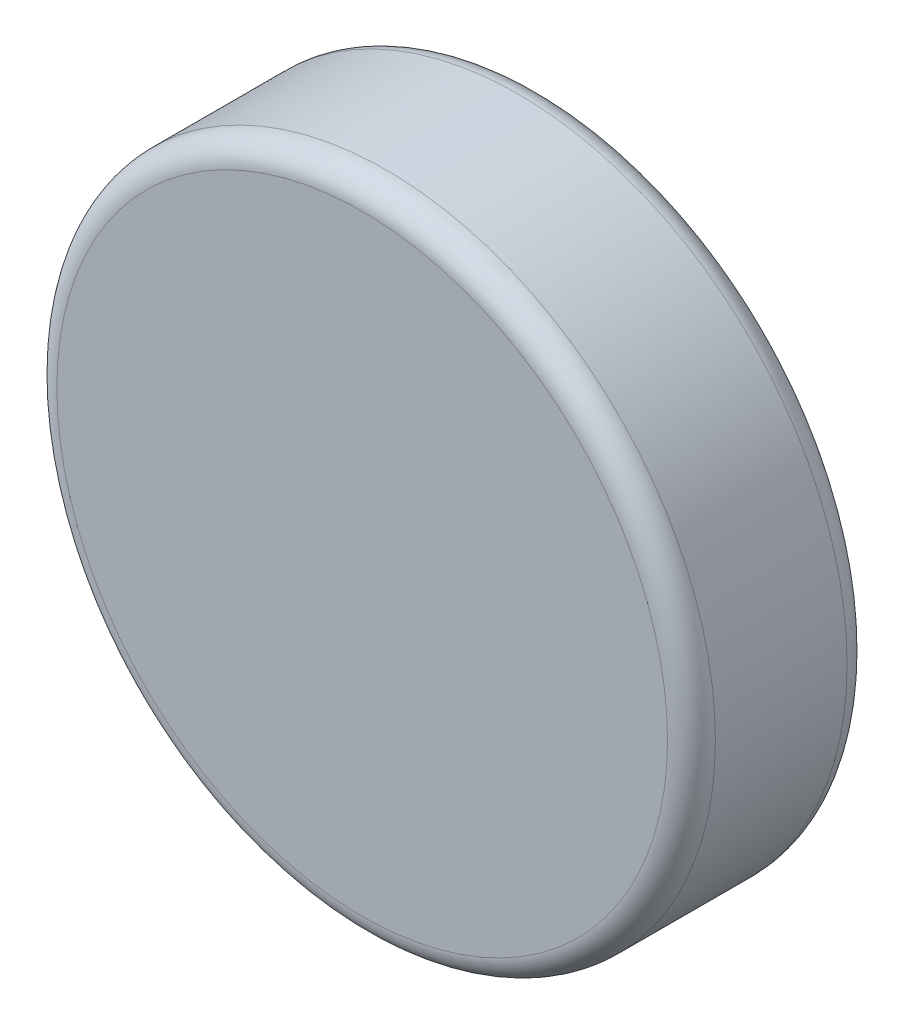
ISO-10303-21;
HEADER;
FILE_DESCRIPTION(('STEP AP214'),'2;1');
FILE_NAME('part.step','',(''),(''),'','','');
FILE_SCHEMA(('AUTOMOTIVE_DESIGN { 1 0 10303 214 1 1 1 1 }'));
ENDSEC;
DATA;
#1=APPLICATION_CONTEXT('core data for automotive mechanical design processes');
#2=APPLICATION_PROTOCOL_DEFINITION('international standard','automotive_design',2000,#1);
#3=PRODUCT_CONTEXT('',#1,'mechanical');
#4=PRODUCT('Part','Part','',(#3));
#5=PRODUCT_RELATED_PRODUCT_CATEGORY('part','',(#4));
#6=PRODUCT_DEFINITION_FORMATION('','',#4);
#7=PRODUCT_DEFINITION_CONTEXT('part definition',#1,'design');
#8=PRODUCT_DEFINITION('design','',#6,#7);
#9=PRODUCT_DEFINITION_SHAPE('','',#8);
#10=(LENGTH_UNIT() NAMED_UNIT(*) SI_UNIT(.MILLI.,.METRE.));
#11=(NAMED_UNIT(*) PLANE_ANGLE_UNIT() SI_UNIT($,.RADIAN.));
#12=(NAMED_UNIT(*) SI_UNIT($,.STERADIAN.) SOLID_ANGLE_UNIT());
#13=UNCERTAINTY_MEASURE_WITH_UNIT(LENGTH_MEASURE(1.E-05),#10,'distance_accuracy_value','');
#14=(GEOMETRIC_REPRESENTATION_CONTEXT(3) GLOBAL_UNCERTAINTY_ASSIGNED_CONTEXT((#13)) GLOBAL_UNIT_ASSIGNED_CONTEXT((#10,
#11,#12)) REPRESENTATION_CONTEXT('',''));
#15=CARTESIAN_POINT('',(0.,0.,0.));
#16=DIRECTION('',(0.,0.,1.));
#17=DIRECTION('',(1.,0.,0.));
#18=AXIS2_PLACEMENT_3D('',#15,#16,#17);
#19=CARTESIAN_POINT('',(0.,0.,15.));
#20=DIRECTION('',(0.,0.,-1.));
#21=DIRECTION('',(-1.,0.,0.));
#22=AXIS2_PLACEMENT_3D('',#19,#20,#21);
#23=CYLINDRICAL_SURFACE('',#22,27.5);
#24=CARTESIAN_POINT('',(0.,0.,2.));
#25=DIRECTION('',(0.,0.,1.));
#26=DIRECTION('',(1.,0.,0.));
#27=AXIS2_PLACEMENT_3D('',#24,#25,#26);
#28=CIRCLE('',#27,27.5);
#29=CARTESIAN_POINT('',(27.5,0.,2.));
#30=VERTEX_POINT('',#29);
#31=EDGE_CURVE('E45',#30,#30,#28,.T.);
#32=ORIENTED_EDGE('',*,*,#31,.T.);
#33=EDGE_LOOP('',(#32));
#34=FACE_BOUND('',#33,.T.);
#35=CARTESIAN_POINT('',(0.,0.,13.));
#36=DIRECTION('',(0.,0.,1.));
#37=DIRECTION('',(1.,0.,0.));
#38=AXIS2_PLACEMENT_3D('',#35,#36,#37);
#39=CIRCLE('',#38,27.5);
#40=CARTESIAN_POINT('',(27.5,0.,13.));
#41=VERTEX_POINT('',#40);
#42=EDGE_CURVE('E49',#41,#41,#39,.F.);
#43=ORIENTED_EDGE('',*,*,#42,.T.);
#44=EDGE_LOOP('',(#43));
#45=FACE_BOUND('',#44,.T.);
#46=ADVANCED_FACE('F34',(#34,#45),#23,.T.);
#47=CARTESIAN_POINT('',(0.,0.,15.));
#48=DIRECTION('',(0.,0.,1.));
#49=DIRECTION('',(1.,0.,0.));
#50=AXIS2_PLACEMENT_3D('',#47,#48,#49);
#51=PLANE('',#50);
#52=CARTESIAN_POINT('',(0.,0.,15.));
#53=DIRECTION('',(0.,0.,1.));
#54=DIRECTION('',(1.,0.,0.));
#55=AXIS2_PLACEMENT_3D('',#52,#53,#54);
#56=CIRCLE('',#55,25.5);
#57=CARTESIAN_POINT('',(25.5,0.,15.));
#58=VERTEX_POINT('',#57);
#59=EDGE_CURVE('E10',#58,#58,#56,.T.);
#60=ORIENTED_EDGE('',*,*,#59,.T.);
#61=EDGE_LOOP('',(#60));
#62=FACE_BOUND('',#61,.T.);
#63=ADVANCED_FACE('F65',(#62),#51,.T.);
#64=CARTESIAN_POINT('',(0.,0.,0.));
#65=DIRECTION('',(0.,0.,1.));
#66=DIRECTION('',(1.,0.,0.));
#67=AXIS2_PLACEMENT_3D('',#64,#65,#66);
#68=PLANE('',#67);
#69=CARTESIAN_POINT('',(0.,0.,0.));
#70=DIRECTION('',(0.,0.,1.));
#71=DIRECTION('',(1.,0.,0.));
#72=AXIS2_PLACEMENT_3D('',#69,#70,#71);
#73=CIRCLE('',#72,25.5);
#74=CARTESIAN_POINT('',(25.5,0.,0.));
#75=VERTEX_POINT('',#74);
#76=EDGE_CURVE('E41',#75,#75,#73,.F.);
#77=ORIENTED_EDGE('',*,*,#76,.T.);
#78=EDGE_LOOP('',(#77));
#79=FACE_BOUND('',#78,.T.);
#80=ADVANCED_FACE('F62',(#79),#68,.F.);
#81=CARTESIAN_POINT('',(0.,0.,2.));
#82=DIRECTION('',(0.,0.,1.));
#83=DIRECTION('',(1.,0.,0.));
#84=AXIS2_PLACEMENT_3D('',#81,#82,#83);
#85=TOROIDAL_SURFACE('',#84,25.5,2.);
#86=ORIENTED_EDGE('',*,*,#76,.F.);
#87=EDGE_LOOP('',(#86));
#88=FACE_BOUND('',#87,.T.);
#89=ORIENTED_EDGE('',*,*,#31,.F.);
#90=EDGE_LOOP('',(#89));
#91=FACE_BOUND('',#90,.T.);
#92=ADVANCED_FACE('F58',(#88,#91),#85,.T.);
#93=CARTESIAN_POINT('',(0.,0.,13.));
#94=DIRECTION('',(0.,0.,1.));
#95=DIRECTION('',(1.,0.,0.));
#96=AXIS2_PLACEMENT_3D('',#93,#94,#95);
#97=TOROIDAL_SURFACE('',#96,25.5,2.);
#98=ORIENTED_EDGE('',*,*,#42,.F.);
#99=EDGE_LOOP('',(#98));
#100=FACE_BOUND('',#99,.T.);
#101=ORIENTED_EDGE('',*,*,#59,.F.);
#102=EDGE_LOOP('',(#101));
#103=FACE_BOUND('',#102,.T.);
#104=ADVANCED_FACE('F36',(#100,#103),#97,.T.);
#105=CLOSED_SHELL('',(#46,#63,#80,#92,#104));
#106=MANIFOLD_SOLID_BREP('B2',#105);
#107=ADVANCED_BREP_SHAPE_REPRESENTATION('',(#18,#106),#14);
#108=SHAPE_DEFINITION_REPRESENTATION(#9,#107);
ENDSEC;
END-ISO-10303-21;
